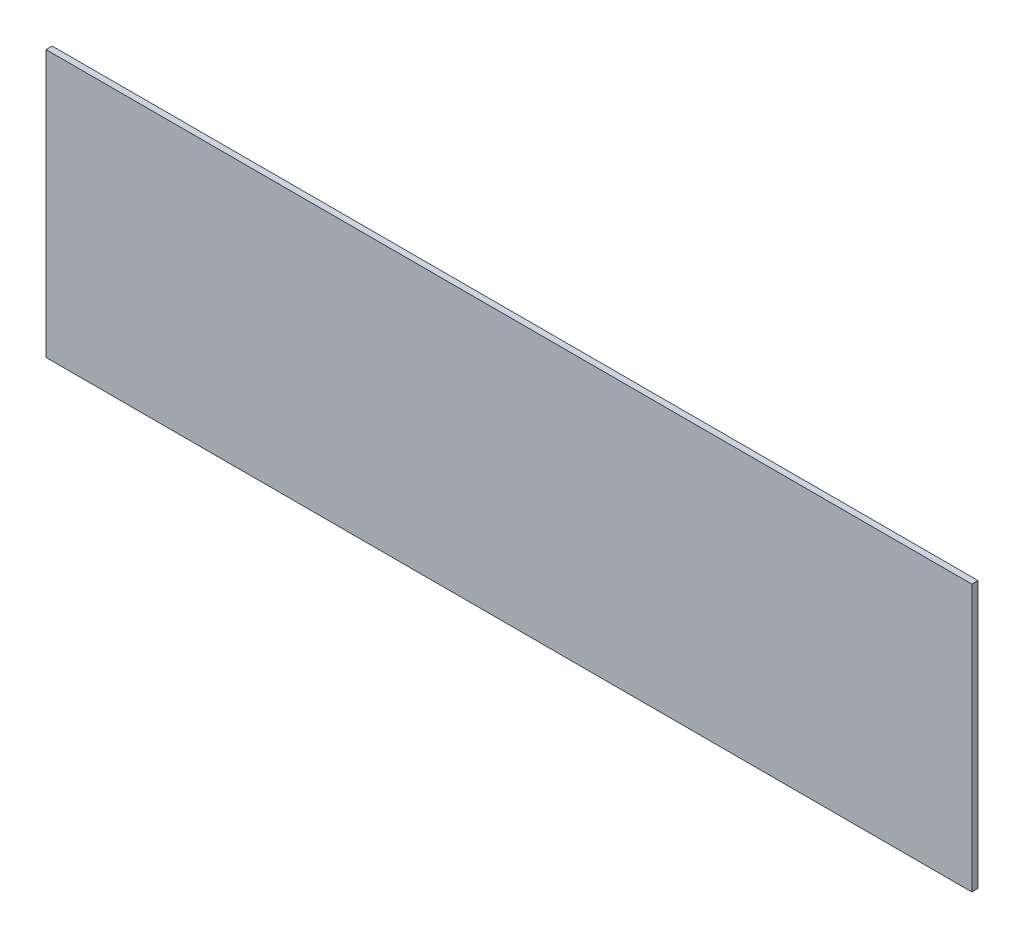
ISO-10303-21;
HEADER;
FILE_DESCRIPTION(('STEP AP214'),'2;1');
FILE_NAME('part.step','',(''),(''),'','','');
FILE_SCHEMA(('AUTOMOTIVE_DESIGN { 1 0 10303 214 1 1 1 1 }'));
ENDSEC;
DATA;
#1=APPLICATION_CONTEXT('core data for automotive mechanical design processes');
#2=APPLICATION_PROTOCOL_DEFINITION('international standard','automotive_design',2000,#1);
#3=PRODUCT_CONTEXT('',#1,'mechanical');
#4=PRODUCT('Part','Part','',(#3));
#5=PRODUCT_RELATED_PRODUCT_CATEGORY('part','',(#4));
#6=PRODUCT_DEFINITION_FORMATION('','',#4);
#7=PRODUCT_DEFINITION_CONTEXT('part definition',#1,'design');
#8=PRODUCT_DEFINITION('design','',#6,#7);
#9=PRODUCT_DEFINITION_SHAPE('','',#8);
#10=(LENGTH_UNIT() NAMED_UNIT(*) SI_UNIT(.MILLI.,.METRE.));
#11=(NAMED_UNIT(*) PLANE_ANGLE_UNIT() SI_UNIT($,.RADIAN.));
#12=(NAMED_UNIT(*) SI_UNIT($,.STERADIAN.) SOLID_ANGLE_UNIT());
#13=UNCERTAINTY_MEASURE_WITH_UNIT(LENGTH_MEASURE(1.E-05),#10,'distance_accuracy_value','');
#14=(GEOMETRIC_REPRESENTATION_CONTEXT(3) GLOBAL_UNCERTAINTY_ASSIGNED_CONTEXT((#13)) GLOBAL_UNIT_ASSIGNED_CONTEXT((#10,
#11,#12)) REPRESENTATION_CONTEXT('',''));
#15=CARTESIAN_POINT('',(0.,0.,0.));
#16=DIRECTION('',(0.,0.,1.));
#17=DIRECTION('',(1.,0.,0.));
#18=AXIS2_PLACEMENT_3D('',#15,#16,#17);
#19=CARTESIAN_POINT('',(-750.,-216.,10.));
#20=DIRECTION('',(1.,0.,0.));
#21=DIRECTION('',(0.,0.,-1.));
#22=AXIS2_PLACEMENT_3D('',#19,#20,#21);
#23=PLANE('',#22);
#24=DIRECTION('',(0.,-1.,0.));
#25=VECTOR('',#24,1.);
#26=CARTESIAN_POINT('',(-750.,-216.,0.));
#27=LINE('',#26,#25);
#28=CARTESIAN_POINT('',(-750.,216.,0.));
#29=VERTEX_POINT('',#28);
#30=CARTESIAN_POINT('',(-750.,-216.,0.));
#31=VERTEX_POINT('',#30);
#32=EDGE_CURVE('E96',#29,#31,#27,.T.);
#33=ORIENTED_EDGE('',*,*,#32,.T.);
#34=DIRECTION('',(0.,0.,-1.));
#35=VECTOR('',#34,1.);
#36=CARTESIAN_POINT('',(-750.,-216.,10.));
#37=LINE('',#36,#35);
#38=CARTESIAN_POINT('',(-750.,-216.,10.));
#39=VERTEX_POINT('',#38);
#40=EDGE_CURVE('E11',#39,#31,#37,.T.);
#41=ORIENTED_EDGE('',*,*,#40,.F.);
#42=DIRECTION('',(0.,-1.,0.));
#43=VECTOR('',#42,1.);
#44=CARTESIAN_POINT('',(-750.,-216.,10.));
#45=LINE('',#44,#43);
#46=CARTESIAN_POINT('',(-750.,216.,10.));
#47=VERTEX_POINT('',#46);
#48=EDGE_CURVE('E84',#47,#39,#45,.T.);
#49=ORIENTED_EDGE('',*,*,#48,.F.);
#50=DIRECTION('',(0.,0.,-1.));
#51=VECTOR('',#50,1.);
#52=CARTESIAN_POINT('',(-750.,216.,10.));
#53=LINE('',#52,#51);
#54=EDGE_CURVE('E92',#47,#29,#53,.T.);
#55=ORIENTED_EDGE('',*,*,#54,.T.);
#56=EDGE_LOOP('',(#33,#41,#49,#55));
#57=FACE_BOUND('',#56,.T.);
#58=ADVANCED_FACE('F33',(#57),#23,.F.);
#59=CARTESIAN_POINT('',(750.,-216.,10.));
#60=DIRECTION('',(0.,1.,0.));
#61=DIRECTION('',(-1.,0.,0.));
#62=AXIS2_PLACEMENT_3D('',#59,#60,#61);
#63=PLANE('',#62);
#64=DIRECTION('',(1.,0.,0.));
#65=VECTOR('',#64,1.);
#66=CARTESIAN_POINT('',(750.,-216.,0.));
#67=LINE('',#66,#65);
#68=CARTESIAN_POINT('',(750.,-216.,0.));
#69=VERTEX_POINT('',#68);
#70=EDGE_CURVE('E88',#31,#69,#67,.T.);
#71=ORIENTED_EDGE('',*,*,#70,.T.);
#72=DIRECTION('',(0.,0.,-1.));
#73=VECTOR('',#72,1.);
#74=CARTESIAN_POINT('',(750.,-216.,10.));
#75=LINE('',#74,#73);
#76=CARTESIAN_POINT('',(750.,-216.,10.));
#77=VERTEX_POINT('',#76);
#78=EDGE_CURVE('E41',#77,#69,#75,.T.);
#79=ORIENTED_EDGE('',*,*,#78,.F.);
#80=DIRECTION('',(1.,0.,0.));
#81=VECTOR('',#80,1.);
#82=CARTESIAN_POINT('',(750.,-216.,10.));
#83=LINE('',#82,#81);
#84=EDGE_CURVE('E79',#39,#77,#83,.T.);
#85=ORIENTED_EDGE('',*,*,#84,.F.);
#86=ORIENTED_EDGE('',*,*,#40,.T.);
#87=EDGE_LOOP('',(#71,#79,#85,#86));
#88=FACE_BOUND('',#87,.T.);
#89=ADVANCED_FACE('F87',(#88),#63,.F.);
#90=CARTESIAN_POINT('',(750.,-216.,10.));
#91=DIRECTION('',(-1.,0.,0.));
#92=DIRECTION('',(0.,0.,1.));
#93=AXIS2_PLACEMENT_3D('',#90,#91,#92);
#94=PLANE('',#93);
#95=DIRECTION('',(0.,1.,0.));
#96=VECTOR('',#95,1.);
#97=CARTESIAN_POINT('',(750.,-216.,0.));
#98=LINE('',#97,#96);
#99=CARTESIAN_POINT('',(750.,216.,0.));
#100=VERTEX_POINT('',#99);
#101=EDGE_CURVE('E66',#69,#100,#98,.T.);
#102=ORIENTED_EDGE('',*,*,#101,.T.);
#103=DIRECTION('',(0.,0.,-1.));
#104=VECTOR('',#103,1.);
#105=CARTESIAN_POINT('',(750.,216.,10.));
#106=LINE('',#105,#104);
#107=CARTESIAN_POINT('',(750.,216.,10.));
#108=VERTEX_POINT('',#107);
#109=EDGE_CURVE('E89',#108,#100,#106,.T.);
#110=ORIENTED_EDGE('',*,*,#109,.F.);
#111=DIRECTION('',(0.,1.,0.));
#112=VECTOR('',#111,1.);
#113=CARTESIAN_POINT('',(750.,-216.,10.));
#114=LINE('',#113,#112);
#115=EDGE_CURVE('E82',#77,#108,#114,.T.);
#116=ORIENTED_EDGE('',*,*,#115,.F.);
#117=ORIENTED_EDGE('',*,*,#78,.T.);
#118=EDGE_LOOP('',(#102,#110,#116,#117));
#119=FACE_BOUND('',#118,.T.);
#120=ADVANCED_FACE('F90',(#119),#94,.F.);
#121=CARTESIAN_POINT('',(750.,216.,10.));
#122=DIRECTION('',(0.,-1.,0.));
#123=DIRECTION('',(1.,0.,0.));
#124=AXIS2_PLACEMENT_3D('',#121,#122,#123);
#125=PLANE('',#124);
#126=DIRECTION('',(-1.,0.,0.));
#127=VECTOR('',#126,1.);
#128=CARTESIAN_POINT('',(750.,216.,0.));
#129=LINE('',#128,#127);
#130=EDGE_CURVE('E72',#100,#29,#129,.T.);
#131=ORIENTED_EDGE('',*,*,#130,.T.);
#132=ORIENTED_EDGE('',*,*,#54,.F.);
#133=DIRECTION('',(-1.,0.,0.));
#134=VECTOR('',#133,1.);
#135=CARTESIAN_POINT('',(750.,216.,10.));
#136=LINE('',#135,#134);
#137=EDGE_CURVE('E49',#108,#47,#136,.T.);
#138=ORIENTED_EDGE('',*,*,#137,.F.);
#139=ORIENTED_EDGE('',*,*,#109,.T.);
#140=EDGE_LOOP('',(#131,#132,#138,#139));
#141=FACE_BOUND('',#140,.T.);
#142=ADVANCED_FACE('F103',(#141),#125,.F.);
#143=CARTESIAN_POINT('',(0.,0.,10.));
#144=DIRECTION('',(0.,0.,1.));
#145=DIRECTION('',(1.,0.,0.));
#146=AXIS2_PLACEMENT_3D('',#143,#144,#145);
#147=PLANE('',#146);
#148=ORIENTED_EDGE('',*,*,#48,.T.);
#149=ORIENTED_EDGE('',*,*,#84,.T.);
#150=ORIENTED_EDGE('',*,*,#115,.T.);
#151=ORIENTED_EDGE('',*,*,#137,.T.);
#152=EDGE_LOOP('',(#148,#149,#150,#151));
#153=FACE_BOUND('',#152,.T.);
#154=ADVANCED_FACE('F80',(#153),#147,.T.);
#155=CARTESIAN_POINT('',(0.,0.,0.));
#156=DIRECTION('',(0.,0.,1.));
#157=DIRECTION('',(1.,0.,0.));
#158=AXIS2_PLACEMENT_3D('',#155,#156,#157);
#159=PLANE('',#158);
#160=ORIENTED_EDGE('',*,*,#32,.F.);
#161=ORIENTED_EDGE('',*,*,#130,.F.);
#162=ORIENTED_EDGE('',*,*,#101,.F.);
#163=ORIENTED_EDGE('',*,*,#70,.F.);
#164=EDGE_LOOP('',(#160,#161,#162,#163));
#165=FACE_BOUND('',#164,.T.);
#166=ADVANCED_FACE('F106',(#165),#159,.F.);
#167=CLOSED_SHELL('',(#58,#89,#120,#142,#154,#166));
#168=MANIFOLD_SOLID_BREP('B2',#167);
#169=ADVANCED_BREP_SHAPE_REPRESENTATION('',(#18,#168),#14);
#170=SHAPE_DEFINITION_REPRESENTATION(#9,#169);
ENDSEC;
END-ISO-10303-21;
